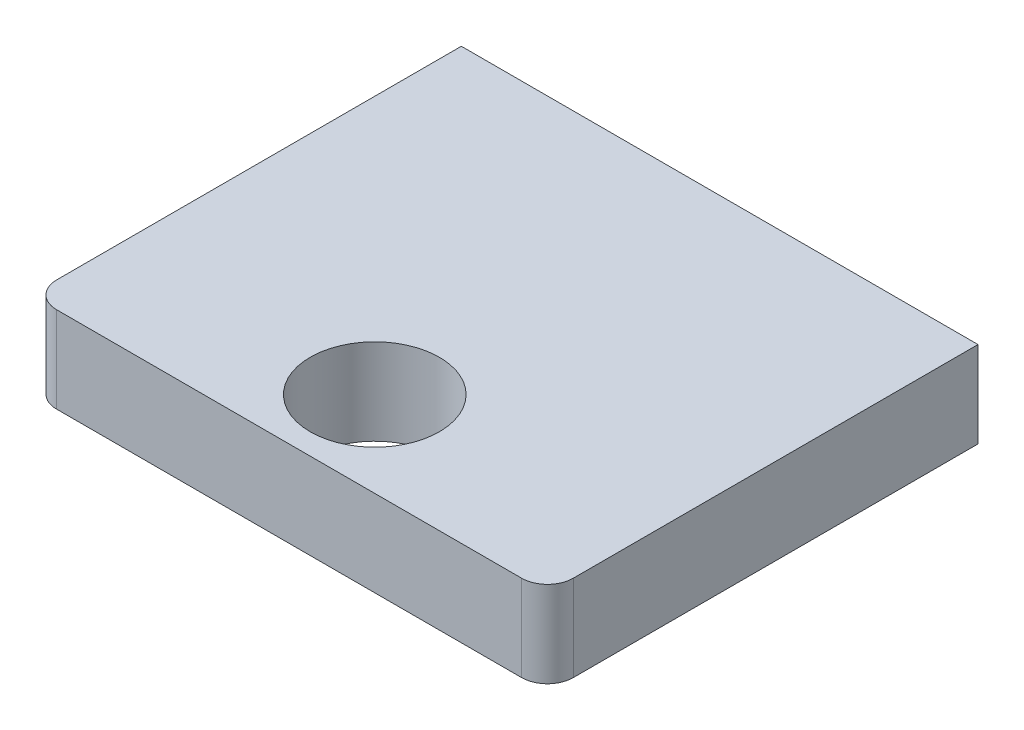
ISO-10303-21;
HEADER;
FILE_DESCRIPTION(('STEP AP214'),'2;1');
FILE_NAME('part.step','',(''),(''),'','','');
FILE_SCHEMA(('AUTOMOTIVE_DESIGN { 1 0 10303 214 1 1 1 1 }'));
ENDSEC;
DATA;
#1=APPLICATION_CONTEXT('core data for automotive mechanical design processes');
#2=APPLICATION_PROTOCOL_DEFINITION('international standard','automotive_design',2000,#1);
#3=PRODUCT_CONTEXT('',#1,'mechanical');
#4=PRODUCT('Part','Part','',(#3));
#5=PRODUCT_RELATED_PRODUCT_CATEGORY('part','',(#4));
#6=PRODUCT_DEFINITION_FORMATION('','',#4);
#7=PRODUCT_DEFINITION_CONTEXT('part definition',#1,'design');
#8=PRODUCT_DEFINITION('design','',#6,#7);
#9=PRODUCT_DEFINITION_SHAPE('','',#8);
#10=(LENGTH_UNIT() NAMED_UNIT(*) SI_UNIT(.MILLI.,.METRE.));
#11=(NAMED_UNIT(*) PLANE_ANGLE_UNIT() SI_UNIT($,.RADIAN.));
#12=(NAMED_UNIT(*) SI_UNIT($,.STERADIAN.) SOLID_ANGLE_UNIT());
#13=UNCERTAINTY_MEASURE_WITH_UNIT(LENGTH_MEASURE(1.E-05),#10,'distance_accuracy_value','');
#14=(GEOMETRIC_REPRESENTATION_CONTEXT(3) GLOBAL_UNCERTAINTY_ASSIGNED_CONTEXT((#13)) GLOBAL_UNIT_ASSIGNED_CONTEXT((#10,
#11,#12)) REPRESENTATION_CONTEXT('',''));
#15=CARTESIAN_POINT('',(0.,0.,0.));
#16=DIRECTION('',(0.,0.,1.));
#17=DIRECTION('',(1.,0.,0.));
#18=AXIS2_PLACEMENT_3D('',#15,#16,#17);
#19=CARTESIAN_POINT('',(30.,10.,-25.));
#20=DIRECTION('',(-1.,0.,0.));
#21=DIRECTION('',(0.,0.,1.));
#22=AXIS2_PLACEMENT_3D('',#19,#20,#21);
#23=PLANE('',#22);
#24=DIRECTION('',(0.,0.,-1.));
#25=VECTOR('',#24,1.);
#26=CARTESIAN_POINT('',(30.,10.,-25.));
#27=LINE('',#26,#25);
#28=CARTESIAN_POINT('',(30.,10.,22.));
#29=VERTEX_POINT('',#28);
#30=CARTESIAN_POINT('',(30.,10.,-25.));
#31=VERTEX_POINT('',#30);
#32=EDGE_CURVE('E89',#29,#31,#27,.T.);
#33=ORIENTED_EDGE('',*,*,#32,.F.);
#34=DIRECTION('',(0.,-1.,0.));
#35=VECTOR('',#34,1.);
#36=CARTESIAN_POINT('',(30.,10.,22.));
#37=LINE('',#36,#35);
#38=CARTESIAN_POINT('',(30.,0.,22.));
#39=VERTEX_POINT('',#38);
#40=EDGE_CURVE('E112',#29,#39,#37,.T.);
#41=ORIENTED_EDGE('',*,*,#40,.T.);
#42=DIRECTION('',(0.,0.,-1.));
#43=VECTOR('',#42,1.);
#44=CARTESIAN_POINT('',(30.,0.,-25.));
#45=LINE('',#44,#43);
#46=CARTESIAN_POINT('',(30.,0.,-25.));
#47=VERTEX_POINT('',#46);
#48=EDGE_CURVE('E110',#39,#47,#45,.T.);
#49=ORIENTED_EDGE('',*,*,#48,.T.);
#50=DIRECTION('',(0.,-1.,0.));
#51=VECTOR('',#50,1.);
#52=CARTESIAN_POINT('',(30.,10.,-25.));
#53=LINE('',#52,#51);
#54=EDGE_CURVE('E104',#31,#47,#53,.T.);
#55=ORIENTED_EDGE('',*,*,#54,.F.);
#56=EDGE_LOOP('',(#33,#41,#49,#55));
#57=FACE_BOUND('',#56,.T.);
#58=ADVANCED_FACE('F35',(#57),#23,.F.);
#59=CARTESIAN_POINT('',(-30.,10.,-25.));
#60=DIRECTION('',(0.,0.,1.));
#61=DIRECTION('',(1.,0.,0.));
#62=AXIS2_PLACEMENT_3D('',#59,#60,#61);
#63=PLANE('',#62);
#64=DIRECTION('',(-1.,0.,0.));
#65=VECTOR('',#64,1.);
#66=CARTESIAN_POINT('',(-30.,0.,-25.));
#67=LINE('',#66,#65);
#68=CARTESIAN_POINT('',(-30.,0.,-25.));
#69=VERTEX_POINT('',#68);
#70=EDGE_CURVE('E139',#47,#69,#67,.T.);
#71=ORIENTED_EDGE('',*,*,#70,.T.);
#72=DIRECTION('',(0.,-1.,0.));
#73=VECTOR('',#72,1.);
#74=CARTESIAN_POINT('',(-30.,10.,-25.));
#75=LINE('',#74,#73);
#76=CARTESIAN_POINT('',(-30.,10.,-25.));
#77=VERTEX_POINT('',#76);
#78=EDGE_CURVE('E106',#77,#69,#75,.T.);
#79=ORIENTED_EDGE('',*,*,#78,.F.);
#80=DIRECTION('',(-1.,0.,0.));
#81=VECTOR('',#80,1.);
#82=CARTESIAN_POINT('',(-30.,10.,-25.));
#83=LINE('',#82,#81);
#84=EDGE_CURVE('E92',#31,#77,#83,.T.);
#85=ORIENTED_EDGE('',*,*,#84,.F.);
#86=ORIENTED_EDGE('',*,*,#54,.T.);
#87=EDGE_LOOP('',(#71,#79,#85,#86));
#88=FACE_BOUND('',#87,.T.);
#89=ADVANCED_FACE('F103',(#88),#63,.F.);
#90=CARTESIAN_POINT('',(-30.,10.,-25.));
#91=DIRECTION('',(1.,0.,0.));
#92=DIRECTION('',(0.,0.,-1.));
#93=AXIS2_PLACEMENT_3D('',#90,#91,#92);
#94=PLANE('',#93);
#95=DIRECTION('',(0.,0.,1.));
#96=VECTOR('',#95,1.);
#97=CARTESIAN_POINT('',(-30.,0.,-25.));
#98=LINE('',#97,#96);
#99=CARTESIAN_POINT('',(-30.,0.,22.));
#100=VERTEX_POINT('',#99);
#101=EDGE_CURVE('E137',#69,#100,#98,.T.);
#102=ORIENTED_EDGE('',*,*,#101,.T.);
#103=DIRECTION('',(0.,-1.,0.));
#104=VECTOR('',#103,1.);
#105=CARTESIAN_POINT('',(-30.,10.,22.));
#106=LINE('',#105,#104);
#107=CARTESIAN_POINT('',(-30.,10.,22.));
#108=VERTEX_POINT('',#107);
#109=EDGE_CURVE('E11',#100,#108,#106,.F.);
#110=ORIENTED_EDGE('',*,*,#109,.T.);
#111=DIRECTION('',(0.,0.,1.));
#112=VECTOR('',#111,1.);
#113=CARTESIAN_POINT('',(-30.,10.,-25.));
#114=LINE('',#113,#112);
#115=EDGE_CURVE('E107',#77,#108,#114,.T.);
#116=ORIENTED_EDGE('',*,*,#115,.F.);
#117=ORIENTED_EDGE('',*,*,#78,.T.);
#118=EDGE_LOOP('',(#102,#110,#116,#117));
#119=FACE_BOUND('',#118,.T.);
#120=ADVANCED_FACE('F138',(#119),#94,.F.);
#121=CARTESIAN_POINT('',(-30.,10.,25.));
#122=DIRECTION('',(0.,0.,-1.));
#123=DIRECTION('',(-1.,0.,0.));
#124=AXIS2_PLACEMENT_3D('',#121,#122,#123);
#125=PLANE('',#124);
#126=DIRECTION('',(1.,0.,0.));
#127=VECTOR('',#126,1.);
#128=CARTESIAN_POINT('',(-30.,0.,25.));
#129=LINE('',#128,#127);
#130=CARTESIAN_POINT('',(-27.,0.,25.));
#131=VERTEX_POINT('',#130);
#132=CARTESIAN_POINT('',(27.,0.,25.));
#133=VERTEX_POINT('',#132);
#134=EDGE_CURVE('E99',#131,#133,#129,.T.);
#135=ORIENTED_EDGE('',*,*,#134,.T.);
#136=DIRECTION('',(0.,-1.,0.));
#137=VECTOR('',#136,1.);
#138=CARTESIAN_POINT('',(27.,10.,25.));
#139=LINE('',#138,#137);
#140=CARTESIAN_POINT('',(27.,10.,25.));
#141=VERTEX_POINT('',#140);
#142=EDGE_CURVE('E56',#133,#141,#139,.F.);
#143=ORIENTED_EDGE('',*,*,#142,.T.);
#144=DIRECTION('',(1.,0.,0.));
#145=VECTOR('',#144,1.);
#146=CARTESIAN_POINT('',(-30.,10.,25.));
#147=LINE('',#146,#145);
#148=CARTESIAN_POINT('',(-27.,10.,25.));
#149=VERTEX_POINT('',#148);
#150=EDGE_CURVE('E116',#149,#141,#147,.T.);
#151=ORIENTED_EDGE('',*,*,#150,.F.);
#152=DIRECTION('',(0.,-1.,0.));
#153=VECTOR('',#152,1.);
#154=CARTESIAN_POINT('',(-27.,10.,25.));
#155=LINE('',#154,#153);
#156=EDGE_CURVE('E123',#149,#131,#155,.T.);
#157=ORIENTED_EDGE('',*,*,#156,.T.);
#158=EDGE_LOOP('',(#135,#143,#151,#157));
#159=FACE_BOUND('',#158,.T.);
#160=ADVANCED_FACE('F131',(#159),#125,.F.);
#161=CARTESIAN_POINT('',(0.,10.,0.));
#162=DIRECTION('',(0.,1.,0.));
#163=DIRECTION('',(0.,0.,1.));
#164=AXIS2_PLACEMENT_3D('',#161,#162,#163);
#165=PLANE('',#164);
#166=CARTESIAN_POINT('',(-1.74339709335669E-13,10.,15.0529222007405));
#167=DIRECTION('',(0.,1.,0.));
#168=DIRECTION('',(0.,0.,1.));
#169=AXIS2_PLACEMENT_3D('',#166,#167,#168);
#170=CIRCLE('',#169,7.5);
#171=CARTESIAN_POINT('',(-1.74339709335669E-13,10.,22.5529222007405));
#172=VERTEX_POINT('',#171);
#173=EDGE_CURVE('E158',#172,#172,#170,.T.);
#174=ORIENTED_EDGE('',*,*,#173,.F.);
#175=EDGE_LOOP('',(#174));
#176=FACE_BOUND('',#175,.T.);
#177=ORIENTED_EDGE('',*,*,#150,.T.);
#178=CARTESIAN_POINT('',(27.,10.,22.));
#179=DIRECTION('',(0.,1.,0.));
#180=DIRECTION('',(0.,0.,1.));
#181=AXIS2_PLACEMENT_3D('',#178,#179,#180);
#182=CIRCLE('',#181,3.);
#183=EDGE_CURVE('E43',#141,#29,#182,.T.);
#184=ORIENTED_EDGE('',*,*,#183,.T.);
#185=ORIENTED_EDGE('',*,*,#32,.T.);
#186=ORIENTED_EDGE('',*,*,#84,.T.);
#187=ORIENTED_EDGE('',*,*,#115,.T.);
#188=CARTESIAN_POINT('',(-27.,10.,22.));
#189=DIRECTION('',(0.,1.,0.));
#190=DIRECTION('',(0.,0.,1.));
#191=AXIS2_PLACEMENT_3D('',#188,#189,#190);
#192=CIRCLE('',#191,3.);
#193=EDGE_CURVE('E127',#108,#149,#192,.T.);
#194=ORIENTED_EDGE('',*,*,#193,.T.);
#195=EDGE_LOOP('',(#177,#184,#185,#186,#187,#194));
#196=FACE_BOUND('',#195,.T.);
#197=ADVANCED_FACE('F91',(#176,#196),#165,.T.);
#198=CARTESIAN_POINT('',(0.,0.,0.));
#199=DIRECTION('',(0.,1.,0.));
#200=DIRECTION('',(0.,0.,1.));
#201=AXIS2_PLACEMENT_3D('',#198,#199,#200);
#202=PLANE('',#201);
#203=CARTESIAN_POINT('',(-1.74339709335669E-13,0.,15.0529222007405));
#204=DIRECTION('',(0.,1.,0.));
#205=DIRECTION('',(0.,0.,1.));
#206=AXIS2_PLACEMENT_3D('',#203,#204,#205);
#207=CIRCLE('',#206,7.5);
#208=CARTESIAN_POINT('',(-1.74339709335669E-13,0.,22.5529222007405));
#209=VERTEX_POINT('',#208);
#210=EDGE_CURVE('E155',#209,#209,#207,.T.);
#211=ORIENTED_EDGE('',*,*,#210,.T.);
#212=EDGE_LOOP('',(#211));
#213=FACE_BOUND('',#212,.T.);
#214=CARTESIAN_POINT('',(-18.,0.,16.9));
#215=DIRECTION('',(0.,-1.,0.));
#216=DIRECTION('',(0.,0.,-1.));
#217=AXIS2_PLACEMENT_3D('',#214,#215,#216);
#218=CIRCLE('',#217,4.);
#219=CARTESIAN_POINT('',(-18.,0.,12.9));
#220=VERTEX_POINT('',#219);
#221=EDGE_CURVE('E149',#220,#220,#218,.T.);
#222=ORIENTED_EDGE('',*,*,#221,.F.);
#223=EDGE_LOOP('',(#222));
#224=FACE_BOUND('',#223,.T.);
#225=CARTESIAN_POINT('',(18.,0.,16.9));
#226=DIRECTION('',(0.,-1.,0.));
#227=DIRECTION('',(0.,0.,-1.));
#228=AXIS2_PLACEMENT_3D('',#225,#226,#227);
#229=CIRCLE('',#228,4.);
#230=CARTESIAN_POINT('',(18.,0.,12.9));
#231=VERTEX_POINT('',#230);
#232=EDGE_CURVE('E146',#231,#231,#229,.T.);
#233=ORIENTED_EDGE('',*,*,#232,.F.);
#234=EDGE_LOOP('',(#233));
#235=FACE_BOUND('',#234,.T.);
#236=ORIENTED_EDGE('',*,*,#48,.F.);
#237=CARTESIAN_POINT('',(27.,0.,22.));
#238=DIRECTION('',(0.,1.,0.));
#239=DIRECTION('',(0.,0.,1.));
#240=AXIS2_PLACEMENT_3D('',#237,#238,#239);
#241=CIRCLE('',#240,3.);
#242=EDGE_CURVE('E121',#39,#133,#241,.F.);
#243=ORIENTED_EDGE('',*,*,#242,.T.);
#244=ORIENTED_EDGE('',*,*,#134,.F.);
#245=CARTESIAN_POINT('',(-27.,0.,22.));
#246=DIRECTION('',(0.,1.,0.));
#247=DIRECTION('',(0.,0.,1.));
#248=AXIS2_PLACEMENT_3D('',#245,#246,#247);
#249=CIRCLE('',#248,3.);
#250=EDGE_CURVE('E114',#131,#100,#249,.F.);
#251=ORIENTED_EDGE('',*,*,#250,.T.);
#252=ORIENTED_EDGE('',*,*,#101,.F.);
#253=ORIENTED_EDGE('',*,*,#70,.F.);
#254=EDGE_LOOP('',(#236,#243,#244,#251,#252,#253));
#255=FACE_BOUND('',#254,.T.);
#256=ADVANCED_FACE('F136',(#213,#224,#235,#255),#202,.F.);
#257=CARTESIAN_POINT('',(18.,0.5,16.9));
#258=DIRECTION('',(0.,-1.,0.));
#259=DIRECTION('',(0.,0.,-1.));
#260=AXIS2_PLACEMENT_3D('',#257,#258,#259);
#261=CYLINDRICAL_SURFACE('',#260,4.);
#262=CARTESIAN_POINT('',(18.,0.5,16.9));
#263=DIRECTION('',(0.,-1.,0.));
#264=DIRECTION('',(0.,0.,-1.));
#265=AXIS2_PLACEMENT_3D('',#262,#263,#264);
#266=CIRCLE('',#265,4.);
#267=CARTESIAN_POINT('',(18.,0.5,12.9));
#268=VERTEX_POINT('',#267);
#269=EDGE_CURVE('E143',#268,#268,#266,.T.);
#270=ORIENTED_EDGE('',*,*,#269,.F.);
#271=EDGE_LOOP('',(#270));
#272=FACE_BOUND('',#271,.T.);
#273=ORIENTED_EDGE('',*,*,#232,.T.);
#274=EDGE_LOOP('',(#273));
#275=FACE_BOUND('',#274,.T.);
#276=ADVANCED_FACE('F178',(#272,#275),#261,.F.);
#277=CARTESIAN_POINT('',(18.,0.5,16.9));
#278=DIRECTION('',(0.,-1.,0.));
#279=DIRECTION('',(0.,0.,-1.));
#280=AXIS2_PLACEMENT_3D('',#277,#278,#279);
#281=PLANE('',#280);
#282=ORIENTED_EDGE('',*,*,#269,.T.);
#283=EDGE_LOOP('',(#282));
#284=FACE_BOUND('',#283,.T.);
#285=ADVANCED_FACE('F204',(#284),#281,.T.);
#286=CARTESIAN_POINT('',(-18.,0.5,16.9));
#287=DIRECTION('',(0.,-1.,0.));
#288=DIRECTION('',(0.,0.,-1.));
#289=AXIS2_PLACEMENT_3D('',#286,#287,#288);
#290=CYLINDRICAL_SURFACE('',#289,4.);
#291=CARTESIAN_POINT('',(-18.,0.5,16.9));
#292=DIRECTION('',(0.,-1.,0.));
#293=DIRECTION('',(0.,0.,-1.));
#294=AXIS2_PLACEMENT_3D('',#291,#292,#293);
#295=CIRCLE('',#294,4.);
#296=CARTESIAN_POINT('',(-18.,0.5,12.9));
#297=VERTEX_POINT('',#296);
#298=EDGE_CURVE('E152',#297,#297,#295,.T.);
#299=ORIENTED_EDGE('',*,*,#298,.F.);
#300=EDGE_LOOP('',(#299));
#301=FACE_BOUND('',#300,.T.);
#302=ORIENTED_EDGE('',*,*,#221,.T.);
#303=EDGE_LOOP('',(#302));
#304=FACE_BOUND('',#303,.T.);
#305=ADVANCED_FACE('F198',(#301,#304),#290,.F.);
#306=CARTESIAN_POINT('',(-18.,0.5,16.9));
#307=DIRECTION('',(0.,-1.,0.));
#308=DIRECTION('',(0.,0.,-1.));
#309=AXIS2_PLACEMENT_3D('',#306,#307,#308);
#310=PLANE('',#309);
#311=ORIENTED_EDGE('',*,*,#298,.T.);
#312=EDGE_LOOP('',(#311));
#313=FACE_BOUND('',#312,.T.);
#314=ADVANCED_FACE('F192',(#313),#310,.T.);
#315=CARTESIAN_POINT('',(27.,10.,22.));
#316=DIRECTION('',(0.,-1.,0.));
#317=DIRECTION('',(0.,0.,-1.));
#318=AXIS2_PLACEMENT_3D('',#315,#316,#317);
#319=CYLINDRICAL_SURFACE('',#318,3.);
#320=ORIENTED_EDGE('',*,*,#183,.F.);
#321=ORIENTED_EDGE('',*,*,#142,.F.);
#322=ORIENTED_EDGE('',*,*,#242,.F.);
#323=ORIENTED_EDGE('',*,*,#40,.F.);
#324=EDGE_LOOP('',(#320,#321,#322,#323));
#325=FACE_BOUND('',#324,.T.);
#326=ADVANCED_FACE('F190',(#325),#319,.T.);
#327=CARTESIAN_POINT('',(-27.,10.,22.));
#328=DIRECTION('',(0.,-1.,0.));
#329=DIRECTION('',(0.,0.,-1.));
#330=AXIS2_PLACEMENT_3D('',#327,#328,#329);
#331=CYLINDRICAL_SURFACE('',#330,3.);
#332=ORIENTED_EDGE('',*,*,#193,.F.);
#333=ORIENTED_EDGE('',*,*,#109,.F.);
#334=ORIENTED_EDGE('',*,*,#250,.F.);
#335=ORIENTED_EDGE('',*,*,#156,.F.);
#336=EDGE_LOOP('',(#332,#333,#334,#335));
#337=FACE_BOUND('',#336,.T.);
#338=ADVANCED_FACE('F37',(#337),#331,.T.);
#339=CARTESIAN_POINT('',(-1.74339709335669E-13,0.,15.0529222007405));
#340=DIRECTION('',(0.,1.,0.));
#341=DIRECTION('',(0.,0.,1.));
#342=AXIS2_PLACEMENT_3D('',#339,#340,#341);
#343=CYLINDRICAL_SURFACE('',#342,7.5);
#344=ORIENTED_EDGE('',*,*,#210,.F.);
#345=EDGE_LOOP('',(#344));
#346=FACE_BOUND('',#345,.T.);
#347=ORIENTED_EDGE('',*,*,#173,.T.);
#348=EDGE_LOOP('',(#347));
#349=FACE_BOUND('',#348,.T.);
#350=ADVANCED_FACE('F166',(#346,#349),#343,.F.);
#351=CLOSED_SHELL('',(#58,#89,#120,#160,#197,#256,#276,#285,#305,#314,#326,#338,#350));
#352=MANIFOLD_SOLID_BREP('B2',#351);
#353=ADVANCED_BREP_SHAPE_REPRESENTATION('',(#18,#352),#14);
#354=SHAPE_DEFINITION_REPRESENTATION(#9,#353);
ENDSEC;
END-ISO-10303-21;
